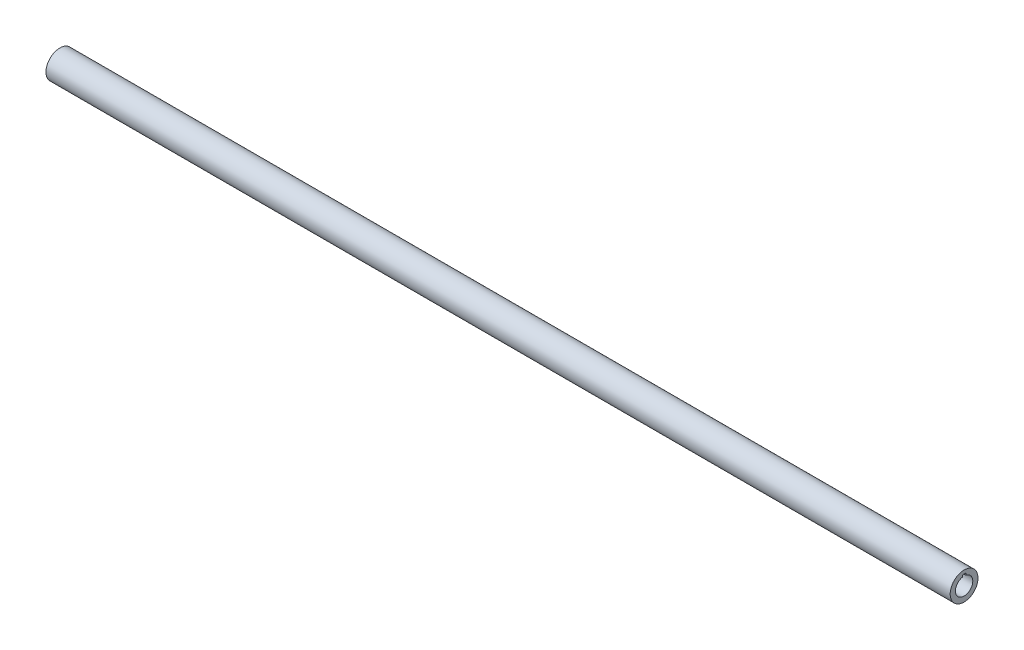
ISO-10303-21;
HEADER;
FILE_DESCRIPTION(('STEP AP214'),'2;1');
FILE_NAME('part.step','',(''),(''),'','','');
FILE_SCHEMA(('AUTOMOTIVE_DESIGN { 1 0 10303 214 1 1 1 1 }'));
ENDSEC;
DATA;
#1=APPLICATION_CONTEXT('core data for automotive mechanical design processes');
#2=APPLICATION_PROTOCOL_DEFINITION('international standard','automotive_design',2000,#1);
#3=PRODUCT_CONTEXT('',#1,'mechanical');
#4=PRODUCT('Part','Part','',(#3));
#5=PRODUCT_RELATED_PRODUCT_CATEGORY('part','',(#4));
#6=PRODUCT_DEFINITION_FORMATION('','',#4);
#7=PRODUCT_DEFINITION_CONTEXT('part definition',#1,'design');
#8=PRODUCT_DEFINITION('design','',#6,#7);
#9=PRODUCT_DEFINITION_SHAPE('','',#8);
#10=(LENGTH_UNIT() NAMED_UNIT(*) SI_UNIT(.MILLI.,.METRE.));
#11=(NAMED_UNIT(*) PLANE_ANGLE_UNIT() SI_UNIT($,.RADIAN.));
#12=(NAMED_UNIT(*) SI_UNIT($,.STERADIAN.) SOLID_ANGLE_UNIT());
#13=UNCERTAINTY_MEASURE_WITH_UNIT(LENGTH_MEASURE(1.E-05),#10,'distance_accuracy_value','');
#14=(GEOMETRIC_REPRESENTATION_CONTEXT(3) GLOBAL_UNCERTAINTY_ASSIGNED_CONTEXT((#13)) GLOBAL_UNIT_ASSIGNED_CONTEXT((#10,
#11,#12)) REPRESENTATION_CONTEXT('',''));
#15=CARTESIAN_POINT('',(0.,0.,0.));
#16=DIRECTION('',(0.,0.,1.));
#17=DIRECTION('',(1.,0.,0.));
#18=AXIS2_PLACEMENT_3D('',#15,#16,#17);
#19=CARTESIAN_POINT('',(3962.4,0.,0.));
#20=DIRECTION('',(-1.,0.,0.));
#21=DIRECTION('',(0.,0.,1.));
#22=AXIS2_PLACEMENT_3D('',#19,#20,#21);
#23=CYLINDRICAL_SURFACE('',#22,60.96);
#24=CARTESIAN_POINT('',(3962.4,0.,0.));
#25=DIRECTION('',(1.,0.,0.));
#26=DIRECTION('',(0.,0.,-1.));
#27=AXIS2_PLACEMENT_3D('',#24,#25,#26);
#28=CIRCLE('',#27,60.96);
#29=CARTESIAN_POINT('',(3962.4,0.,-60.96));
#30=VERTEX_POINT('',#29);
#31=EDGE_CURVE('E11',#30,#30,#28,.T.);
#32=ORIENTED_EDGE('',*,*,#31,.F.);
#33=EDGE_LOOP('',(#32));
#34=FACE_BOUND('',#33,.T.);
#35=CARTESIAN_POINT('',(0.,0.,0.));
#36=DIRECTION('',(1.,0.,0.));
#37=DIRECTION('',(0.,0.,-1.));
#38=AXIS2_PLACEMENT_3D('',#35,#36,#37);
#39=CIRCLE('',#38,60.96);
#40=CARTESIAN_POINT('',(0.,0.,-60.96));
#41=VERTEX_POINT('',#40);
#42=EDGE_CURVE('E36',#41,#41,#39,.T.);
#43=ORIENTED_EDGE('',*,*,#42,.T.);
#44=EDGE_LOOP('',(#43));
#45=FACE_BOUND('',#44,.T.);
#46=ADVANCED_FACE('F33',(#34,#45),#23,.T.);
#47=CARTESIAN_POINT('',(3962.4,0.,0.));
#48=DIRECTION('',(1.,0.,0.));
#49=DIRECTION('',(0.,0.,-1.));
#50=AXIS2_PLACEMENT_3D('',#47,#48,#49);
#51=PLANE('',#50);
#52=DIRECTION('',(0.,-1.,0.));
#53=VECTOR('',#52,1.);
#54=CARTESIAN_POINT('',(3962.4,45.72,7.62));
#55=LINE('',#54,#53);
#56=CARTESIAN_POINT('',(3962.4,45.72,7.62));
#57=VERTEX_POINT('',#56);
#58=CARTESIAN_POINT('',(3962.4,37.3302236800156,7.62));
#59=VERTEX_POINT('',#58);
#60=EDGE_CURVE('E122',#57,#59,#55,.T.);
#61=ORIENTED_EDGE('',*,*,#60,.F.);
#62=DIRECTION('',(0.,0.,1.));
#63=VECTOR('',#62,1.);
#64=CARTESIAN_POINT('',(3962.4,45.72,7.62));
#65=LINE('',#64,#63);
#66=CARTESIAN_POINT('',(3962.4,45.72,-7.62));
#67=VERTEX_POINT('',#66);
#68=EDGE_CURVE('E125',#67,#57,#65,.T.);
#69=ORIENTED_EDGE('',*,*,#68,.F.);
#70=DIRECTION('',(0.,1.,0.));
#71=VECTOR('',#70,1.);
#72=CARTESIAN_POINT('',(3962.4,45.72,-7.62));
#73=LINE('',#72,#71);
#74=CARTESIAN_POINT('',(3962.4,37.3302236800156,-7.62));
#75=VERTEX_POINT('',#74);
#76=EDGE_CURVE('E112',#75,#67,#73,.T.);
#77=ORIENTED_EDGE('',*,*,#76,.F.);
#78=CARTESIAN_POINT('',(3962.4,0.,0.));
#79=DIRECTION('',(1.,0.,0.));
#80=DIRECTION('',(0.,0.,-1.));
#81=AXIS2_PLACEMENT_3D('',#78,#79,#80);
#82=CIRCLE('',#81,38.1);
#83=EDGE_CURVE('E133',#59,#75,#82,.T.);
#84=ORIENTED_EDGE('',*,*,#83,.F.);
#85=EDGE_LOOP('',(#61,#69,#77,#84));
#86=FACE_BOUND('',#85,.T.);
#87=ORIENTED_EDGE('',*,*,#31,.T.);
#88=EDGE_LOOP('',(#87));
#89=FACE_BOUND('',#88,.T.);
#90=ADVANCED_FACE('F195',(#86,#89),#51,.T.);
#91=CARTESIAN_POINT('',(0.,0.,0.));
#92=DIRECTION('',(1.,0.,0.));
#93=DIRECTION('',(0.,0.,-1.));
#94=AXIS2_PLACEMENT_3D('',#91,#92,#93);
#95=PLANE('',#94);
#96=CARTESIAN_POINT('',(0.,0.,0.));
#97=DIRECTION('',(-1.,0.,0.));
#98=DIRECTION('',(0.,0.,1.));
#99=AXIS2_PLACEMENT_3D('',#96,#97,#98);
#100=CIRCLE('',#99,38.1);
#101=CARTESIAN_POINT('',(0.,37.3302236800156,-7.62));
#102=VERTEX_POINT('',#101);
#103=CARTESIAN_POINT('',(0.,37.3302236800156,7.62));
#104=VERTEX_POINT('',#103);
#105=EDGE_CURVE('E159',#102,#104,#100,.T.);
#106=ORIENTED_EDGE('',*,*,#105,.F.);
#107=DIRECTION('',(0.,-1.,0.));
#108=VECTOR('',#107,1.);
#109=CARTESIAN_POINT('',(0.,45.72,-7.62));
#110=LINE('',#109,#108);
#111=CARTESIAN_POINT('',(0.,45.72,-7.62));
#112=VERTEX_POINT('',#111);
#113=EDGE_CURVE('E141',#112,#102,#110,.T.);
#114=ORIENTED_EDGE('',*,*,#113,.F.);
#115=DIRECTION('',(0.,0.,1.));
#116=VECTOR('',#115,1.);
#117=CARTESIAN_POINT('',(0.,45.72,-7.62));
#118=LINE('',#117,#116);
#119=CARTESIAN_POINT('',(0.,45.72,7.62));
#120=VERTEX_POINT('',#119);
#121=EDGE_CURVE('E147',#112,#120,#118,.T.);
#122=ORIENTED_EDGE('',*,*,#121,.T.);
#123=DIRECTION('',(0.,-1.,0.));
#124=VECTOR('',#123,1.);
#125=CARTESIAN_POINT('',(0.,45.72,7.62));
#126=LINE('',#125,#124);
#127=EDGE_CURVE('E135',#120,#104,#126,.T.);
#128=ORIENTED_EDGE('',*,*,#127,.T.);
#129=EDGE_LOOP('',(#106,#114,#122,#128));
#130=FACE_BOUND('',#129,.T.);
#131=ORIENTED_EDGE('',*,*,#42,.F.);
#132=EDGE_LOOP('',(#131));
#133=FACE_BOUND('',#132,.T.);
#134=ADVANCED_FACE('F170',(#130,#133),#95,.F.);
#135=CARTESIAN_POINT('',(304.8,0.,0.));
#136=DIRECTION('',(-1.,0.,0.));
#137=DIRECTION('',(0.,0.,1.));
#138=AXIS2_PLACEMENT_3D('',#135,#136,#137);
#139=CYLINDRICAL_SURFACE('',#138,38.1);
#140=CARTESIAN_POINT('',(304.8,0.,0.));
#141=DIRECTION('',(-1.,0.,0.));
#142=DIRECTION('',(0.,0.,1.));
#143=AXIS2_PLACEMENT_3D('',#140,#141,#142);
#144=CIRCLE('',#143,38.1);
#145=CARTESIAN_POINT('',(304.8,37.3302236800156,-7.62));
#146=VERTEX_POINT('',#145);
#147=CARTESIAN_POINT('',(304.8,37.3302236800156,7.62));
#148=VERTEX_POINT('',#147);
#149=EDGE_CURVE('E160',#146,#148,#144,.T.);
#150=ORIENTED_EDGE('',*,*,#149,.F.);
#151=DIRECTION('',(-1.,0.,0.));
#152=VECTOR('',#151,1.);
#153=CARTESIAN_POINT('',(304.8,37.3302236800156,-7.62));
#154=LINE('',#153,#152);
#155=EDGE_CURVE('E156',#146,#102,#154,.T.);
#156=ORIENTED_EDGE('',*,*,#155,.T.);
#157=ORIENTED_EDGE('',*,*,#105,.T.);
#158=DIRECTION('',(-1.,0.,0.));
#159=VECTOR('',#158,1.);
#160=CARTESIAN_POINT('',(304.8,37.3302236800156,7.62));
#161=LINE('',#160,#159);
#162=EDGE_CURVE('E153',#148,#104,#161,.T.);
#163=ORIENTED_EDGE('',*,*,#162,.F.);
#164=EDGE_LOOP('',(#150,#156,#157,#163));
#165=FACE_BOUND('',#164,.T.);
#166=ADVANCED_FACE('F167',(#165),#139,.F.);
#167=CARTESIAN_POINT('',(304.8,0.,0.));
#168=DIRECTION('',(-1.,0.,0.));
#169=DIRECTION('',(0.,0.,1.));
#170=AXIS2_PLACEMENT_3D('',#167,#168,#169);
#171=PLANE('',#170);
#172=ORIENTED_EDGE('',*,*,#149,.T.);
#173=DIRECTION('',(0.,-1.,0.));
#174=VECTOR('',#173,1.);
#175=CARTESIAN_POINT('',(304.8,45.72,7.62));
#176=LINE('',#175,#174);
#177=CARTESIAN_POINT('',(304.8,45.72,7.62));
#178=VERTEX_POINT('',#177);
#179=EDGE_CURVE('E138',#178,#148,#176,.T.);
#180=ORIENTED_EDGE('',*,*,#179,.F.);
#181=DIRECTION('',(0.,0.,1.));
#182=VECTOR('',#181,1.);
#183=CARTESIAN_POINT('',(304.8,45.72,-7.62));
#184=LINE('',#183,#182);
#185=CARTESIAN_POINT('',(304.8,45.72,-7.62));
#186=VERTEX_POINT('',#185);
#187=EDGE_CURVE('E140',#186,#178,#184,.T.);
#188=ORIENTED_EDGE('',*,*,#187,.F.);
#189=DIRECTION('',(0.,-1.,0.));
#190=VECTOR('',#189,1.);
#191=CARTESIAN_POINT('',(304.8,45.72,-7.62));
#192=LINE('',#191,#190);
#193=EDGE_CURVE('E55',#186,#146,#192,.T.);
#194=ORIENTED_EDGE('',*,*,#193,.T.);
#195=EDGE_LOOP('',(#172,#180,#188,#194));
#196=FACE_BOUND('',#195,.T.);
#197=ADVANCED_FACE('F178',(#196),#171,.T.);
#198=CARTESIAN_POINT('',(304.8,45.72,-7.62));
#199=DIRECTION('',(0.,0.,-1.));
#200=DIRECTION('',(0.,1.,0.));
#201=AXIS2_PLACEMENT_3D('',#198,#199,#200);
#202=PLANE('',#201);
#203=ORIENTED_EDGE('',*,*,#193,.F.);
#204=DIRECTION('',(-1.,0.,0.));
#205=VECTOR('',#204,1.);
#206=CARTESIAN_POINT('',(304.8,45.72,-7.62));
#207=LINE('',#206,#205);
#208=EDGE_CURVE('E151',#186,#112,#207,.T.);
#209=ORIENTED_EDGE('',*,*,#208,.T.);
#210=ORIENTED_EDGE('',*,*,#113,.T.);
#211=ORIENTED_EDGE('',*,*,#155,.F.);
#212=EDGE_LOOP('',(#203,#209,#210,#211));
#213=FACE_BOUND('',#212,.T.);
#214=ADVANCED_FACE('F181',(#213),#202,.F.);
#215=CARTESIAN_POINT('',(304.8,45.72,7.62));
#216=DIRECTION('',(0.,0.,-1.));
#217=DIRECTION('',(0.,1.,0.));
#218=AXIS2_PLACEMENT_3D('',#215,#216,#217);
#219=PLANE('',#218);
#220=ORIENTED_EDGE('',*,*,#162,.T.);
#221=ORIENTED_EDGE('',*,*,#127,.F.);
#222=DIRECTION('',(-1.,0.,0.));
#223=VECTOR('',#222,1.);
#224=CARTESIAN_POINT('',(304.8,45.72,7.62));
#225=LINE('',#224,#223);
#226=EDGE_CURVE('E144',#178,#120,#225,.T.);
#227=ORIENTED_EDGE('',*,*,#226,.F.);
#228=ORIENTED_EDGE('',*,*,#179,.T.);
#229=EDGE_LOOP('',(#220,#221,#227,#228));
#230=FACE_BOUND('',#229,.T.);
#231=ADVANCED_FACE('F176',(#230),#219,.T.);
#232=CARTESIAN_POINT('',(304.8,45.72,-7.62));
#233=DIRECTION('',(0.,-1.,0.));
#234=DIRECTION('',(0.,0.,-1.));
#235=AXIS2_PLACEMENT_3D('',#232,#233,#234);
#236=PLANE('',#235);
#237=ORIENTED_EDGE('',*,*,#121,.F.);
#238=ORIENTED_EDGE('',*,*,#208,.F.);
#239=ORIENTED_EDGE('',*,*,#187,.T.);
#240=ORIENTED_EDGE('',*,*,#226,.T.);
#241=EDGE_LOOP('',(#237,#238,#239,#240));
#242=FACE_BOUND('',#241,.T.);
#243=ADVANCED_FACE('F182',(#242),#236,.T.);
#244=CARTESIAN_POINT('',(3657.6,0.,0.));
#245=DIRECTION('',(1.,0.,0.));
#246=DIRECTION('',(0.,0.,-1.));
#247=AXIS2_PLACEMENT_3D('',#244,#245,#246);
#248=CYLINDRICAL_SURFACE('',#247,38.1);
#249=CARTESIAN_POINT('',(3657.6,0.,0.));
#250=DIRECTION('',(1.,0.,0.));
#251=DIRECTION('',(0.,0.,-1.));
#252=AXIS2_PLACEMENT_3D('',#249,#250,#251);
#253=CIRCLE('',#252,38.1);
#254=CARTESIAN_POINT('',(3657.6,37.3302236800156,7.62));
#255=VERTEX_POINT('',#254);
#256=CARTESIAN_POINT('',(3657.6,37.3302236800156,-7.62));
#257=VERTEX_POINT('',#256);
#258=EDGE_CURVE('E104',#255,#257,#253,.T.);
#259=ORIENTED_EDGE('',*,*,#258,.F.);
#260=DIRECTION('',(1.,0.,0.));
#261=VECTOR('',#260,1.);
#262=CARTESIAN_POINT('',(3657.6,37.3302236800156,7.62));
#263=LINE('',#262,#261);
#264=EDGE_CURVE('E130',#255,#59,#263,.T.);
#265=ORIENTED_EDGE('',*,*,#264,.T.);
#266=ORIENTED_EDGE('',*,*,#83,.T.);
#267=DIRECTION('',(1.,0.,0.));
#268=VECTOR('',#267,1.);
#269=CARTESIAN_POINT('',(3657.6,37.3302236800156,-7.62));
#270=LINE('',#269,#268);
#271=EDGE_CURVE('E127',#75,#257,#270,.F.);
#272=ORIENTED_EDGE('',*,*,#271,.T.);
#273=EDGE_LOOP('',(#259,#265,#266,#272));
#274=FACE_BOUND('',#273,.T.);
#275=ADVANCED_FACE('F184',(#274),#248,.F.);
#276=CARTESIAN_POINT('',(3657.6,0.,0.));
#277=DIRECTION('',(1.,0.,0.));
#278=DIRECTION('',(0.,0.,-1.));
#279=AXIS2_PLACEMENT_3D('',#276,#277,#278);
#280=PLANE('',#279);
#281=ORIENTED_EDGE('',*,*,#258,.T.);
#282=DIRECTION('',(0.,1.,0.));
#283=VECTOR('',#282,1.);
#284=CARTESIAN_POINT('',(3657.6,45.72,-7.62));
#285=LINE('',#284,#283);
#286=CARTESIAN_POINT('',(3657.6,45.72,-7.62));
#287=VERTEX_POINT('',#286);
#288=EDGE_CURVE('E98',#257,#287,#285,.T.);
#289=ORIENTED_EDGE('',*,*,#288,.T.);
#290=DIRECTION('',(0.,0.,1.));
#291=VECTOR('',#290,1.);
#292=CARTESIAN_POINT('',(3657.6,45.72,7.62));
#293=LINE('',#292,#291);
#294=CARTESIAN_POINT('',(3657.6,45.72,7.62));
#295=VERTEX_POINT('',#294);
#296=EDGE_CURVE('E102',#287,#295,#293,.T.);
#297=ORIENTED_EDGE('',*,*,#296,.T.);
#298=DIRECTION('',(0.,-1.,0.));
#299=VECTOR('',#298,1.);
#300=CARTESIAN_POINT('',(3657.6,45.72,7.62));
#301=LINE('',#300,#299);
#302=EDGE_CURVE('E47',#295,#255,#301,.T.);
#303=ORIENTED_EDGE('',*,*,#302,.T.);
#304=EDGE_LOOP('',(#281,#289,#297,#303));
#305=FACE_BOUND('',#304,.T.);
#306=ADVANCED_FACE('F100',(#305),#280,.T.);
#307=CARTESIAN_POINT('',(3657.6,45.72,7.62));
#308=DIRECTION('',(0.,0.,1.));
#309=DIRECTION('',(0.,-1.,0.));
#310=AXIS2_PLACEMENT_3D('',#307,#308,#309);
#311=PLANE('',#310);
#312=ORIENTED_EDGE('',*,*,#302,.F.);
#313=DIRECTION('',(1.,0.,0.));
#314=VECTOR('',#313,1.);
#315=CARTESIAN_POINT('',(3657.6,45.72,7.62));
#316=LINE('',#315,#314);
#317=EDGE_CURVE('E116',#295,#57,#316,.T.);
#318=ORIENTED_EDGE('',*,*,#317,.T.);
#319=ORIENTED_EDGE('',*,*,#60,.T.);
#320=ORIENTED_EDGE('',*,*,#264,.F.);
#321=EDGE_LOOP('',(#312,#318,#319,#320));
#322=FACE_BOUND('',#321,.T.);
#323=ADVANCED_FACE('F221',(#322),#311,.F.);
#324=CARTESIAN_POINT('',(3657.6,45.72,-7.62));
#325=DIRECTION('',(0.,0.,-1.));
#326=DIRECTION('',(0.,1.,0.));
#327=AXIS2_PLACEMENT_3D('',#324,#325,#326);
#328=PLANE('',#327);
#329=ORIENTED_EDGE('',*,*,#76,.T.);
#330=DIRECTION('',(1.,0.,0.));
#331=VECTOR('',#330,1.);
#332=CARTESIAN_POINT('',(3657.6,45.72,-7.62));
#333=LINE('',#332,#331);
#334=EDGE_CURVE('E109',#287,#67,#333,.T.);
#335=ORIENTED_EDGE('',*,*,#334,.F.);
#336=ORIENTED_EDGE('',*,*,#288,.F.);
#337=ORIENTED_EDGE('',*,*,#271,.F.);
#338=EDGE_LOOP('',(#329,#335,#336,#337));
#339=FACE_BOUND('',#338,.T.);
#340=ADVANCED_FACE('F110',(#339),#328,.F.);
#341=CARTESIAN_POINT('',(3657.6,45.72,7.62));
#342=DIRECTION('',(0.,1.,0.));
#343=DIRECTION('',(0.,0.,1.));
#344=AXIS2_PLACEMENT_3D('',#341,#342,#343);
#345=PLANE('',#344);
#346=ORIENTED_EDGE('',*,*,#68,.T.);
#347=ORIENTED_EDGE('',*,*,#317,.F.);
#348=ORIENTED_EDGE('',*,*,#296,.F.);
#349=ORIENTED_EDGE('',*,*,#334,.T.);
#350=EDGE_LOOP('',(#346,#347,#348,#349));
#351=FACE_BOUND('',#350,.T.);
#352=ADVANCED_FACE('F118',(#351),#345,.F.);
#353=CLOSED_SHELL('',(#46,#90,#134,#166,#197,#214,#231,#243,#275,#306,#323,#340,#352));
#354=MANIFOLD_SOLID_BREP('B2',#353);
#355=ADVANCED_BREP_SHAPE_REPRESENTATION('',(#18,#354),#14);
#356=SHAPE_DEFINITION_REPRESENTATION(#9,#355);
ENDSEC;
END-ISO-10303-21;
